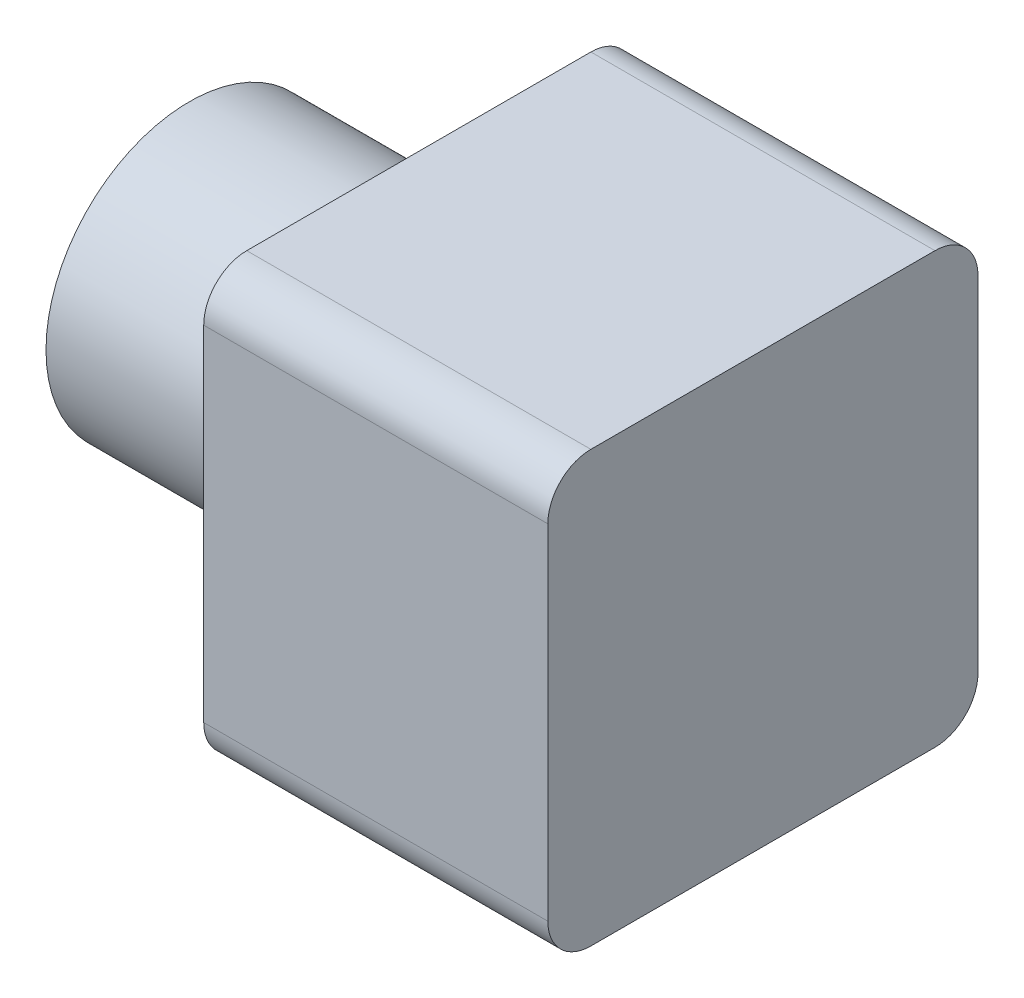
ISO-10303-21;
HEADER;
FILE_DESCRIPTION(('STEP AP214'),'2;1');
FILE_NAME('part.step','',(''),(''),'','','');
FILE_SCHEMA(('AUTOMOTIVE_DESIGN { 1 0 10303 214 1 1 1 1 }'));
ENDSEC;
DATA;
#1=APPLICATION_CONTEXT('core data for automotive mechanical design processes');
#2=APPLICATION_PROTOCOL_DEFINITION('international standard','automotive_design',2000,#1);
#3=PRODUCT_CONTEXT('',#1,'mechanical');
#4=PRODUCT('Part','Part','',(#3));
#5=PRODUCT_RELATED_PRODUCT_CATEGORY('part','',(#4));
#6=PRODUCT_DEFINITION_FORMATION('','',#4);
#7=PRODUCT_DEFINITION_CONTEXT('part definition',#1,'design');
#8=PRODUCT_DEFINITION('design','',#6,#7);
#9=PRODUCT_DEFINITION_SHAPE('','',#8);
#10=(LENGTH_UNIT() NAMED_UNIT(*) SI_UNIT(.MILLI.,.METRE.));
#11=(NAMED_UNIT(*) PLANE_ANGLE_UNIT() SI_UNIT($,.RADIAN.));
#12=(NAMED_UNIT(*) SI_UNIT($,.STERADIAN.) SOLID_ANGLE_UNIT());
#13=UNCERTAINTY_MEASURE_WITH_UNIT(LENGTH_MEASURE(1.E-05),#10,'distance_accuracy_value','');
#14=(GEOMETRIC_REPRESENTATION_CONTEXT(3) GLOBAL_UNCERTAINTY_ASSIGNED_CONTEXT((#13)) GLOBAL_UNIT_ASSIGNED_CONTEXT((#10,
#11,#12)) REPRESENTATION_CONTEXT('',''));
#15=CARTESIAN_POINT('',(0.,0.,0.));
#16=DIRECTION('',(0.,0.,1.));
#17=DIRECTION('',(1.,0.,0.));
#18=AXIS2_PLACEMENT_3D('',#15,#16,#17);
#19=CARTESIAN_POINT('',(-44.1378295770701,-31.6005777705285,-25.0000000000001));
#20=DIRECTION('',(1.,0.,0.));
#21=DIRECTION('',(0.,0.,-1.));
#22=AXIS2_PLACEMENT_3D('',#19,#20,#21);
#23=CYLINDRICAL_SURFACE('',#22,5.);
#24=CARTESIAN_POINT('',(-44.1378295770701,-31.6005777705285,-25.0000000000001));
#25=DIRECTION('',(-1.,0.,0.));
#26=DIRECTION('',(0.,0.,1.));
#27=AXIS2_PLACEMENT_3D('',#24,#25,#26);
#28=CIRCLE('',#27,5.);
#29=CARTESIAN_POINT('',(-44.1378295770701,-31.6005777705285,-20.0000000000001));
#30=VERTEX_POINT('',#29);
#31=EDGE_CURVE('E139',#30,#30,#28,.T.);
#32=ORIENTED_EDGE('',*,*,#31,.F.);
#33=EDGE_LOOP('',(#32));
#34=FACE_BOUND('',#33,.T.);
#35=CARTESIAN_POINT('',(-36.1378295770701,-31.6005777705285,-25.0000000000001));
#36=DIRECTION('',(-1.,0.,0.));
#37=DIRECTION('',(0.,0.,1.));
#38=AXIS2_PLACEMENT_3D('',#35,#36,#37);
#39=CIRCLE('',#38,5.);
#40=CARTESIAN_POINT('',(-36.1378295770701,-31.6005777705285,-20.0000000000001));
#41=VERTEX_POINT('',#40);
#42=EDGE_CURVE('E142',#41,#41,#39,.T.);
#43=ORIENTED_EDGE('',*,*,#42,.T.);
#44=EDGE_LOOP('',(#43));
#45=FACE_BOUND('',#44,.T.);
#46=ADVANCED_FACE('F35',(#34,#45),#23,.T.);
#47=CARTESIAN_POINT('',(-44.1378295770701,-31.6005777705285,-25.0000000000001));
#48=DIRECTION('',(-1.,0.,0.));
#49=DIRECTION('',(0.,0.,1.));
#50=AXIS2_PLACEMENT_3D('',#47,#48,#49);
#51=PLANE('',#50);
#52=CARTESIAN_POINT('',(-44.1378295770701,-31.6005777705285,-25.0000000000001));
#53=DIRECTION('',(-1.,0.,0.));
#54=DIRECTION('',(0.,0.,1.));
#55=AXIS2_PLACEMENT_3D('',#52,#53,#54);
#56=CIRCLE('',#55,3.99999999999999);
#57=CARTESIAN_POINT('',(-44.1378295770701,-31.6005777705285,-21.0000000000001));
#58=VERTEX_POINT('',#57);
#59=EDGE_CURVE('E184',#58,#58,#56,.T.);
#60=ORIENTED_EDGE('',*,*,#59,.F.);
#61=EDGE_LOOP('',(#60));
#62=FACE_BOUND('',#61,.T.);
#63=ORIENTED_EDGE('',*,*,#31,.T.);
#64=EDGE_LOOP('',(#63));
#65=FACE_BOUND('',#64,.T.);
#66=ADVANCED_FACE('F198',(#62,#65),#51,.T.);
#67=CARTESIAN_POINT('',(-24.1378295770701,-24.1005777705285,-17.5));
#68=DIRECTION('',(0.,0.,-1.));
#69=DIRECTION('',(-1.,0.,0.));
#70=AXIS2_PLACEMENT_3D('',#67,#68,#69);
#71=PLANE('',#70);
#72=DIRECTION('',(0.,-1.,0.));
#73=VECTOR('',#72,1.);
#74=CARTESIAN_POINT('',(-36.1378295770701,-24.1005777705285,-17.5000000000001));
#75=LINE('',#74,#73);
#76=CARTESIAN_POINT('',(-36.1378295770701,-25.6005777705285,-17.5000000000001));
#77=VERTEX_POINT('',#76);
#78=CARTESIAN_POINT('',(-36.1378295770701,-37.6005777705285,-17.5000000000001));
#79=VERTEX_POINT('',#78);
#80=EDGE_CURVE('E128',#77,#79,#75,.T.);
#81=ORIENTED_EDGE('',*,*,#80,.T.);
#82=DIRECTION('',(-1.,0.,0.));
#83=VECTOR('',#82,1.);
#84=CARTESIAN_POINT('',(-24.1378295770701,-37.6005777705285,-17.5000000000001));
#85=LINE('',#84,#83);
#86=CARTESIAN_POINT('',(-24.1378295770701,-37.6005777705285,-17.5000000000001));
#87=VERTEX_POINT('',#86);
#88=EDGE_CURVE('E106',#79,#87,#85,.F.);
#89=ORIENTED_EDGE('',*,*,#88,.T.);
#90=DIRECTION('',(0.,-1.,0.));
#91=VECTOR('',#90,1.);
#92=CARTESIAN_POINT('',(-24.1378295770701,-24.1005777705285,-17.5));
#93=LINE('',#92,#91);
#94=CARTESIAN_POINT('',(-24.1378295770701,-25.6005777705285,-17.5));
#95=VERTEX_POINT('',#94);
#96=EDGE_CURVE('E138',#95,#87,#93,.T.);
#97=ORIENTED_EDGE('',*,*,#96,.F.);
#98=DIRECTION('',(-1.,0.,0.));
#99=VECTOR('',#98,1.);
#100=CARTESIAN_POINT('',(-24.1378295770701,-25.6005777705285,-17.5));
#101=LINE('',#100,#99);
#102=EDGE_CURVE('E111',#95,#77,#101,.T.);
#103=ORIENTED_EDGE('',*,*,#102,.T.);
#104=EDGE_LOOP('',(#81,#89,#97,#103));
#105=FACE_BOUND('',#104,.T.);
#106=ADVANCED_FACE('F201',(#105),#71,.F.);
#107=CARTESIAN_POINT('',(-24.1378295770701,-39.1005777705285,-17.5000000000001));
#108=DIRECTION('',(0.,1.,0.));
#109=DIRECTION('',(-1.,0.,0.));
#110=AXIS2_PLACEMENT_3D('',#107,#108,#109);
#111=PLANE('',#110);
#112=DIRECTION('',(0.,0.,-1.));
#113=VECTOR('',#112,1.);
#114=CARTESIAN_POINT('',(-24.1378295770701,-39.1005777705285,-17.5000000000001));
#115=LINE('',#114,#113);
#116=CARTESIAN_POINT('',(-24.1378295770701,-39.1005777705285,-19.0000000000001));
#117=VERTEX_POINT('',#116);
#118=CARTESIAN_POINT('',(-24.1378295770701,-39.1005777705285,-31.0000000000001));
#119=VERTEX_POINT('',#118);
#120=EDGE_CURVE('E121',#117,#119,#115,.T.);
#121=ORIENTED_EDGE('',*,*,#120,.F.);
#122=DIRECTION('',(-1.,0.,0.));
#123=VECTOR('',#122,1.);
#124=CARTESIAN_POINT('',(-24.1378295770701,-39.1005777705285,-19.0000000000001));
#125=LINE('',#124,#123);
#126=CARTESIAN_POINT('',(-36.1378295770701,-39.1005777705285,-19.0000000000001));
#127=VERTEX_POINT('',#126);
#128=EDGE_CURVE('E105',#117,#127,#125,.T.);
#129=ORIENTED_EDGE('',*,*,#128,.T.);
#130=DIRECTION('',(0.,0.,-1.));
#131=VECTOR('',#130,1.);
#132=CARTESIAN_POINT('',(-36.1378295770701,-39.1005777705285,-17.5000000000001));
#133=LINE('',#132,#131);
#134=CARTESIAN_POINT('',(-36.1378295770701,-39.1005777705285,-31.0000000000001));
#135=VERTEX_POINT('',#134);
#136=EDGE_CURVE('E118',#127,#135,#133,.T.);
#137=ORIENTED_EDGE('',*,*,#136,.T.);
#138=DIRECTION('',(-1.,0.,0.));
#139=VECTOR('',#138,1.);
#140=CARTESIAN_POINT('',(-24.1378295770701,-39.1005777705285,-31.0000000000001));
#141=LINE('',#140,#139);
#142=EDGE_CURVE('E123',#135,#119,#141,.F.);
#143=ORIENTED_EDGE('',*,*,#142,.T.);
#144=EDGE_LOOP('',(#121,#129,#137,#143));
#145=FACE_BOUND('',#144,.T.);
#146=ADVANCED_FACE('F117',(#145),#111,.F.);
#147=CARTESIAN_POINT('',(-24.1378295770701,-24.1005777705285,-32.5000000000001));
#148=DIRECTION('',(0.,0.,1.));
#149=DIRECTION('',(1.,0.,0.));
#150=AXIS2_PLACEMENT_3D('',#147,#148,#149);
#151=PLANE('',#150);
#152=DIRECTION('',(0.,1.,0.));
#153=VECTOR('',#152,1.);
#154=CARTESIAN_POINT('',(-24.1378295770701,-24.1005777705285,-32.5000000000001));
#155=LINE('',#154,#153);
#156=CARTESIAN_POINT('',(-24.1378295770701,-37.6005777705285,-32.5000000000001));
#157=VERTEX_POINT('',#156);
#158=CARTESIAN_POINT('',(-24.1378295770701,-25.6005777705285,-32.5000000000001));
#159=VERTEX_POINT('',#158);
#160=EDGE_CURVE('E170',#157,#159,#155,.T.);
#161=ORIENTED_EDGE('',*,*,#160,.F.);
#162=DIRECTION('',(-1.,0.,0.));
#163=VECTOR('',#162,1.);
#164=CARTESIAN_POINT('',(-24.1378295770701,-37.6005777705285,-32.5000000000001));
#165=LINE('',#164,#163);
#166=CARTESIAN_POINT('',(-36.1378295770701,-37.6005777705285,-32.5000000000001));
#167=VERTEX_POINT('',#166);
#168=EDGE_CURVE('E163',#157,#167,#165,.T.);
#169=ORIENTED_EDGE('',*,*,#168,.T.);
#170=DIRECTION('',(0.,1.,0.));
#171=VECTOR('',#170,1.);
#172=CARTESIAN_POINT('',(-36.1378295770701,-24.1005777705285,-32.5000000000001));
#173=LINE('',#172,#171);
#174=CARTESIAN_POINT('',(-36.1378295770701,-25.6005777705285,-32.5000000000001));
#175=VERTEX_POINT('',#174);
#176=EDGE_CURVE('E127',#167,#175,#173,.T.);
#177=ORIENTED_EDGE('',*,*,#176,.T.);
#178=DIRECTION('',(-1.,0.,0.));
#179=VECTOR('',#178,1.);
#180=CARTESIAN_POINT('',(-24.1378295770701,-25.6005777705285,-32.5000000000001));
#181=LINE('',#180,#179);
#182=EDGE_CURVE('E161',#175,#159,#181,.F.);
#183=ORIENTED_EDGE('',*,*,#182,.T.);
#184=EDGE_LOOP('',(#161,#169,#177,#183));
#185=FACE_BOUND('',#184,.T.);
#186=ADVANCED_FACE('F168',(#185),#151,.F.);
#187=CARTESIAN_POINT('',(-24.1378295770701,-24.1005777705285,-17.5));
#188=DIRECTION('',(0.,-1.,0.));
#189=DIRECTION('',(1.,0.,0.));
#190=AXIS2_PLACEMENT_3D('',#187,#188,#189);
#191=PLANE('',#190);
#192=DIRECTION('',(0.,0.,1.));
#193=VECTOR('',#192,1.);
#194=CARTESIAN_POINT('',(-24.1378295770701,-24.1005777705285,-17.5));
#195=LINE('',#194,#193);
#196=CARTESIAN_POINT('',(-24.1378295770701,-24.1005777705285,-31.0000000000001));
#197=VERTEX_POINT('',#196);
#198=CARTESIAN_POINT('',(-24.1378295770701,-24.1005777705285,-19.0000000000001));
#199=VERTEX_POINT('',#198);
#200=EDGE_CURVE('E145',#197,#199,#195,.T.);
#201=ORIENTED_EDGE('',*,*,#200,.F.);
#202=DIRECTION('',(-1.,0.,0.));
#203=VECTOR('',#202,1.);
#204=CARTESIAN_POINT('',(-24.1378295770701,-24.1005777705285,-31.0000000000001));
#205=LINE('',#204,#203);
#206=CARTESIAN_POINT('',(-36.1378295770701,-24.1005777705285,-31.0000000000001));
#207=VERTEX_POINT('',#206);
#208=EDGE_CURVE('E11',#197,#207,#205,.T.);
#209=ORIENTED_EDGE('',*,*,#208,.T.);
#210=DIRECTION('',(0.,0.,1.));
#211=VECTOR('',#210,1.);
#212=CARTESIAN_POINT('',(-36.1378295770701,-24.1005777705285,-17.5000000000001));
#213=LINE('',#212,#211);
#214=CARTESIAN_POINT('',(-36.1378295770701,-24.1005777705285,-19.0000000000001));
#215=VERTEX_POINT('',#214);
#216=EDGE_CURVE('E131',#207,#215,#213,.T.);
#217=ORIENTED_EDGE('',*,*,#216,.T.);
#218=DIRECTION('',(-1.,0.,0.));
#219=VECTOR('',#218,1.);
#220=CARTESIAN_POINT('',(-24.1378295770701,-24.1005777705285,-19.0000000000001));
#221=LINE('',#220,#219);
#222=EDGE_CURVE('E43',#215,#199,#221,.F.);
#223=ORIENTED_EDGE('',*,*,#222,.T.);
#224=EDGE_LOOP('',(#201,#209,#217,#223));
#225=FACE_BOUND('',#224,.T.);
#226=ADVANCED_FACE('F177',(#225),#191,.F.);
#227=CARTESIAN_POINT('',(-24.1378295770701,0.,0.));
#228=DIRECTION('',(1.,0.,0.));
#229=DIRECTION('',(0.,0.,-1.));
#230=AXIS2_PLACEMENT_3D('',#227,#228,#229);
#231=PLANE('',#230);
#232=ORIENTED_EDGE('',*,*,#96,.T.);
#233=CARTESIAN_POINT('',(-24.1378295770701,-37.6005777705285,-19.0000000000001));
#234=DIRECTION('',(1.,0.,0.));
#235=DIRECTION('',(0.,0.,-1.));
#236=AXIS2_PLACEMENT_3D('',#233,#234,#235);
#237=CIRCLE('',#236,1.5);
#238=EDGE_CURVE('E159',#87,#117,#237,.T.);
#239=ORIENTED_EDGE('',*,*,#238,.T.);
#240=ORIENTED_EDGE('',*,*,#120,.T.);
#241=CARTESIAN_POINT('',(-24.1378295770701,-37.6005777705285,-31.0000000000001));
#242=DIRECTION('',(1.,0.,0.));
#243=DIRECTION('',(0.,0.,-1.));
#244=AXIS2_PLACEMENT_3D('',#241,#242,#243);
#245=CIRCLE('',#244,1.5);
#246=EDGE_CURVE('E157',#119,#157,#245,.T.);
#247=ORIENTED_EDGE('',*,*,#246,.T.);
#248=ORIENTED_EDGE('',*,*,#160,.T.);
#249=CARTESIAN_POINT('',(-24.1378295770701,-25.6005777705285,-31.0000000000001));
#250=DIRECTION('',(1.,0.,0.));
#251=DIRECTION('',(0.,0.,-1.));
#252=AXIS2_PLACEMENT_3D('',#249,#250,#251);
#253=CIRCLE('',#252,1.5);
#254=EDGE_CURVE('E56',#159,#197,#253,.T.);
#255=ORIENTED_EDGE('',*,*,#254,.T.);
#256=ORIENTED_EDGE('',*,*,#200,.T.);
#257=CARTESIAN_POINT('',(-24.1378295770701,-25.6005777705285,-19.0000000000001));
#258=DIRECTION('',(1.,0.,0.));
#259=DIRECTION('',(0.,0.,-1.));
#260=AXIS2_PLACEMENT_3D('',#257,#258,#259);
#261=CIRCLE('',#260,1.5);
#262=EDGE_CURVE('E154',#199,#95,#261,.T.);
#263=ORIENTED_EDGE('',*,*,#262,.T.);
#264=EDGE_LOOP('',(#232,#239,#240,#247,#248,#255,#256,#263));
#265=FACE_BOUND('',#264,.T.);
#266=ADVANCED_FACE('F211',(#265),#231,.T.);
#267=CARTESIAN_POINT('',(-36.1378295770701,0.,0.));
#268=DIRECTION('',(1.,0.,0.));
#269=DIRECTION('',(0.,0.,-1.));
#270=AXIS2_PLACEMENT_3D('',#267,#268,#269);
#271=PLANE('',#270);
#272=ORIENTED_EDGE('',*,*,#42,.F.);
#273=EDGE_LOOP('',(#272));
#274=FACE_BOUND('',#273,.T.);
#275=ORIENTED_EDGE('',*,*,#136,.F.);
#276=CARTESIAN_POINT('',(-36.1378295770701,-37.6005777705285,-19.0000000000001));
#277=DIRECTION('',(1.,0.,0.));
#278=DIRECTION('',(0.,0.,-1.));
#279=AXIS2_PLACEMENT_3D('',#276,#277,#278);
#280=CIRCLE('',#279,1.5);
#281=EDGE_CURVE('E101',#127,#79,#280,.F.);
#282=ORIENTED_EDGE('',*,*,#281,.T.);
#283=ORIENTED_EDGE('',*,*,#80,.F.);
#284=CARTESIAN_POINT('',(-36.1378295770701,-25.6005777705285,-19.0000000000001));
#285=DIRECTION('',(1.,0.,0.));
#286=DIRECTION('',(0.,0.,-1.));
#287=AXIS2_PLACEMENT_3D('',#284,#285,#286);
#288=CIRCLE('',#287,1.5);
#289=EDGE_CURVE('E122',#77,#215,#288,.F.);
#290=ORIENTED_EDGE('',*,*,#289,.T.);
#291=ORIENTED_EDGE('',*,*,#216,.F.);
#292=CARTESIAN_POINT('',(-36.1378295770701,-25.6005777705285,-31.0000000000001));
#293=DIRECTION('',(1.,0.,0.));
#294=DIRECTION('',(0.,0.,-1.));
#295=AXIS2_PLACEMENT_3D('',#292,#293,#294);
#296=CIRCLE('',#295,1.5);
#297=EDGE_CURVE('E148',#207,#175,#296,.F.);
#298=ORIENTED_EDGE('',*,*,#297,.T.);
#299=ORIENTED_EDGE('',*,*,#176,.F.);
#300=CARTESIAN_POINT('',(-36.1378295770701,-37.6005777705285,-31.0000000000001));
#301=DIRECTION('',(1.,0.,0.));
#302=DIRECTION('',(0.,0.,-1.));
#303=AXIS2_PLACEMENT_3D('',#300,#301,#302);
#304=CIRCLE('',#303,1.5);
#305=EDGE_CURVE('E112',#167,#135,#304,.F.);
#306=ORIENTED_EDGE('',*,*,#305,.T.);
#307=EDGE_LOOP('',(#275,#282,#283,#290,#291,#298,#299,#306));
#308=FACE_BOUND('',#307,.T.);
#309=ADVANCED_FACE('F125',(#274,#308),#271,.F.);
#310=CARTESIAN_POINT('',(-43.1378295770701,-31.6005777705285,-25.0000000000001));
#311=DIRECTION('',(-1.,0.,0.));
#312=DIRECTION('',(0.,0.,1.));
#313=AXIS2_PLACEMENT_3D('',#310,#311,#312);
#314=CYLINDRICAL_SURFACE('',#313,3.99999999999999);
#315=CARTESIAN_POINT('',(-43.1378295770701,-31.6005777705285,-25.0000000000001));
#316=DIRECTION('',(-1.,0.,0.));
#317=DIRECTION('',(0.,0.,1.));
#318=AXIS2_PLACEMENT_3D('',#315,#316,#317);
#319=CIRCLE('',#318,3.99999999999999);
#320=CARTESIAN_POINT('',(-43.1378295770701,-31.6005777705285,-21.0000000000001));
#321=VERTEX_POINT('',#320);
#322=EDGE_CURVE('E133',#321,#321,#319,.T.);
#323=ORIENTED_EDGE('',*,*,#322,.F.);
#324=EDGE_LOOP('',(#323));
#325=FACE_BOUND('',#324,.T.);
#326=ORIENTED_EDGE('',*,*,#59,.T.);
#327=EDGE_LOOP('',(#326));
#328=FACE_BOUND('',#327,.T.);
#329=ADVANCED_FACE('F192',(#325,#328),#314,.F.);
#330=CARTESIAN_POINT('',(-43.1378295770701,-31.6005777705285,-25.0000000000001));
#331=DIRECTION('',(-1.,0.,0.));
#332=DIRECTION('',(0.,0.,1.));
#333=AXIS2_PLACEMENT_3D('',#330,#331,#332);
#334=PLANE('',#333);
#335=ORIENTED_EDGE('',*,*,#322,.T.);
#336=EDGE_LOOP('',(#335));
#337=FACE_BOUND('',#336,.T.);
#338=ADVANCED_FACE('F190',(#337),#334,.T.);
#339=CARTESIAN_POINT('',(-24.1378295770701,-37.6005777705285,-19.0000000000001));
#340=DIRECTION('',(-1.,0.,0.));
#341=DIRECTION('',(0.,0.,1.));
#342=AXIS2_PLACEMENT_3D('',#339,#340,#341);
#343=CYLINDRICAL_SURFACE('',#342,1.5);
#344=ORIENTED_EDGE('',*,*,#238,.F.);
#345=ORIENTED_EDGE('',*,*,#88,.F.);
#346=ORIENTED_EDGE('',*,*,#281,.F.);
#347=ORIENTED_EDGE('',*,*,#128,.F.);
#348=EDGE_LOOP('',(#344,#345,#346,#347));
#349=FACE_BOUND('',#348,.T.);
#350=ADVANCED_FACE('F104',(#349),#343,.T.);
#351=CARTESIAN_POINT('',(-24.1378295770701,-37.6005777705285,-31.0000000000001));
#352=DIRECTION('',(-1.,0.,0.));
#353=DIRECTION('',(0.,0.,1.));
#354=AXIS2_PLACEMENT_3D('',#351,#352,#353);
#355=CYLINDRICAL_SURFACE('',#354,1.5);
#356=ORIENTED_EDGE('',*,*,#246,.F.);
#357=ORIENTED_EDGE('',*,*,#142,.F.);
#358=ORIENTED_EDGE('',*,*,#305,.F.);
#359=ORIENTED_EDGE('',*,*,#168,.F.);
#360=EDGE_LOOP('',(#356,#357,#358,#359));
#361=FACE_BOUND('',#360,.T.);
#362=ADVANCED_FACE('F229',(#361),#355,.T.);
#363=CARTESIAN_POINT('',(-24.1378295770701,-25.6005777705285,-31.0000000000001));
#364=DIRECTION('',(-1.,0.,0.));
#365=DIRECTION('',(0.,0.,1.));
#366=AXIS2_PLACEMENT_3D('',#363,#364,#365);
#367=CYLINDRICAL_SURFACE('',#366,1.5);
#368=ORIENTED_EDGE('',*,*,#254,.F.);
#369=ORIENTED_EDGE('',*,*,#182,.F.);
#370=ORIENTED_EDGE('',*,*,#297,.F.);
#371=ORIENTED_EDGE('',*,*,#208,.F.);
#372=EDGE_LOOP('',(#368,#369,#370,#371));
#373=FACE_BOUND('',#372,.T.);
#374=ADVANCED_FACE('F176',(#373),#367,.T.);
#375=CARTESIAN_POINT('',(-24.1378295770701,-25.6005777705285,-19.0000000000001));
#376=DIRECTION('',(-1.,0.,0.));
#377=DIRECTION('',(0.,0.,1.));
#378=AXIS2_PLACEMENT_3D('',#375,#376,#377);
#379=CYLINDRICAL_SURFACE('',#378,1.5);
#380=ORIENTED_EDGE('',*,*,#262,.F.);
#381=ORIENTED_EDGE('',*,*,#222,.F.);
#382=ORIENTED_EDGE('',*,*,#289,.F.);
#383=ORIENTED_EDGE('',*,*,#102,.F.);
#384=EDGE_LOOP('',(#380,#381,#382,#383));
#385=FACE_BOUND('',#384,.T.);
#386=ADVANCED_FACE('F37',(#385),#379,.T.);
#387=CLOSED_SHELL('',(#46,#66,#106,#146,#186,#226,#266,#309,#329,#338,#350,#362,#374,#386));
#388=MANIFOLD_SOLID_BREP('B2',#387);
#389=ADVANCED_BREP_SHAPE_REPRESENTATION('',(#18,#388),#14);
#390=SHAPE_DEFINITION_REPRESENTATION(#9,#389);
ENDSEC;
END-ISO-10303-21;
